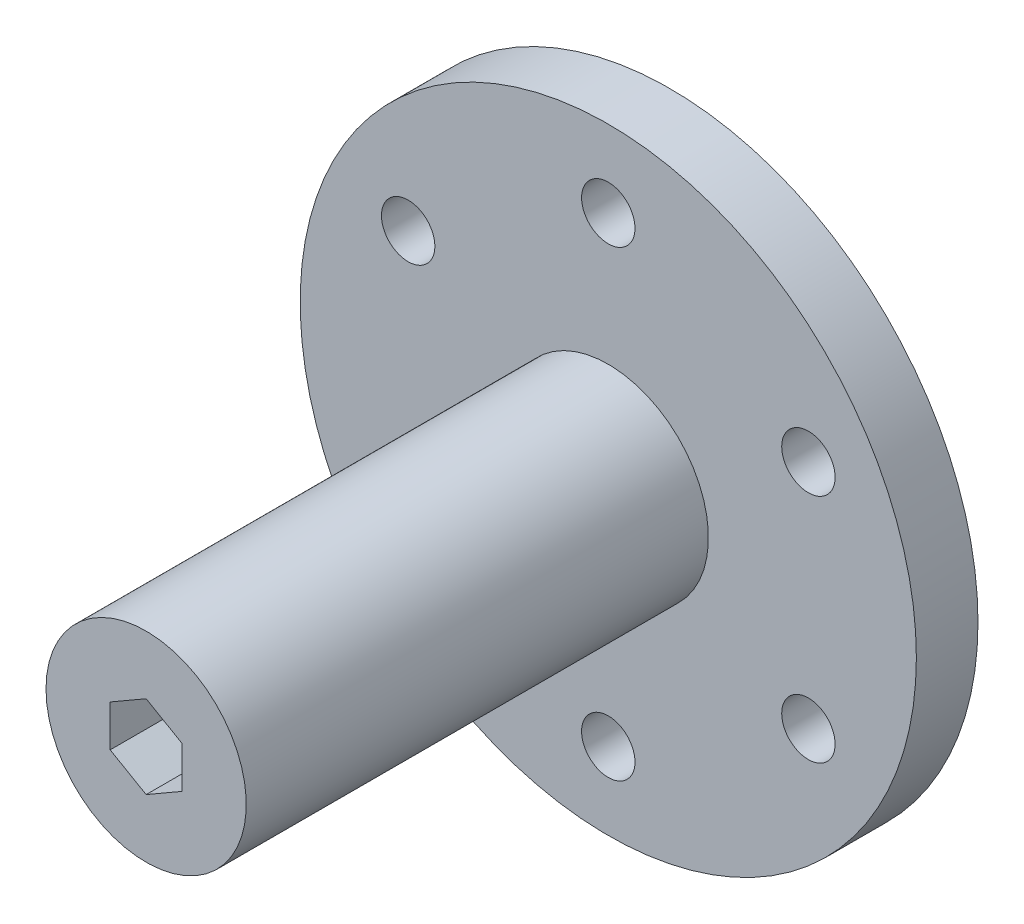
ISO-10303-21;
HEADER;
FILE_DESCRIPTION(('STEP AP214'),'2;1');
FILE_NAME('part.step','',(''),(''),'','','');
FILE_SCHEMA(('AUTOMOTIVE_DESIGN { 1 0 10303 214 1 1 1 1 }'));
ENDSEC;
DATA;
#1=APPLICATION_CONTEXT('core data for automotive mechanical design processes');
#2=APPLICATION_PROTOCOL_DEFINITION('international standard','automotive_design',2000,#1);
#3=PRODUCT_CONTEXT('',#1,'mechanical');
#4=PRODUCT('Part','Part','',(#3));
#5=PRODUCT_RELATED_PRODUCT_CATEGORY('part','',(#4));
#6=PRODUCT_DEFINITION_FORMATION('','',#4);
#7=PRODUCT_DEFINITION_CONTEXT('part definition',#1,'design');
#8=PRODUCT_DEFINITION('design','',#6,#7);
#9=PRODUCT_DEFINITION_SHAPE('','',#8);
#10=(LENGTH_UNIT() NAMED_UNIT(*) SI_UNIT(.MILLI.,.METRE.));
#11=(NAMED_UNIT(*) PLANE_ANGLE_UNIT() SI_UNIT($,.RADIAN.));
#12=(NAMED_UNIT(*) SI_UNIT($,.STERADIAN.) SOLID_ANGLE_UNIT());
#13=UNCERTAINTY_MEASURE_WITH_UNIT(LENGTH_MEASURE(1.E-05),#10,'distance_accuracy_value','');
#14=(GEOMETRIC_REPRESENTATION_CONTEXT(3) GLOBAL_UNCERTAINTY_ASSIGNED_CONTEXT((#13)) GLOBAL_UNIT_ASSIGNED_CONTEXT((#10,
#11,#12)) REPRESENTATION_CONTEXT('',''));
#15=CARTESIAN_POINT('',(0.,0.,0.));
#16=DIRECTION('',(0.,0.,1.));
#17=DIRECTION('',(1.,0.,0.));
#18=AXIS2_PLACEMENT_3D('',#15,#16,#17);
#19=CARTESIAN_POINT('',(0.,0.,6.));
#20=DIRECTION('',(0.,0.,-1.));
#21=DIRECTION('',(-1.,0.,0.));
#22=AXIS2_PLACEMENT_3D('',#19,#20,#21);
#23=CYLINDRICAL_SURFACE('',#22,30.);
#24=CARTESIAN_POINT('',(0.,0.,6.));
#25=DIRECTION('',(0.,0.,1.));
#26=DIRECTION('',(1.,0.,0.));
#27=AXIS2_PLACEMENT_3D('',#24,#25,#26);
#28=CIRCLE('',#27,30.);
#29=CARTESIAN_POINT('',(30.,0.,6.));
#30=VERTEX_POINT('',#29);
#31=EDGE_CURVE('E54',#30,#30,#28,.T.);
#32=ORIENTED_EDGE('',*,*,#31,.F.);
#33=EDGE_LOOP('',(#32));
#34=FACE_BOUND('',#33,.T.);
#35=CARTESIAN_POINT('',(0.,0.,0.));
#36=DIRECTION('',(0.,0.,1.));
#37=DIRECTION('',(1.,0.,0.));
#38=AXIS2_PLACEMENT_3D('',#35,#36,#37);
#39=CIRCLE('',#38,30.);
#40=CARTESIAN_POINT('',(30.,0.,0.));
#41=VERTEX_POINT('',#40);
#42=EDGE_CURVE('E48',#41,#41,#39,.T.);
#43=ORIENTED_EDGE('',*,*,#42,.T.);
#44=EDGE_LOOP('',(#43));
#45=FACE_BOUND('',#44,.T.);
#46=ADVANCED_FACE('F45',(#34,#45),#23,.T.);
#47=CARTESIAN_POINT('',(0.,0.,6.));
#48=DIRECTION('',(0.,0.,1.));
#49=DIRECTION('',(1.,0.,0.));
#50=AXIS2_PLACEMENT_3D('',#47,#48,#49);
#51=PLANE('',#50);
#52=CARTESIAN_POINT('',(0.,22.5,6.));
#53=DIRECTION('',(0.,0.,1.));
#54=DIRECTION('',(1.,0.,0.));
#55=AXIS2_PLACEMENT_3D('',#52,#53,#54);
#56=CIRCLE('',#55,2.6);
#57=CARTESIAN_POINT('',(2.6,22.5,6.));
#58=VERTEX_POINT('',#57);
#59=EDGE_CURVE('E129',#58,#58,#56,.T.);
#60=ORIENTED_EDGE('',*,*,#59,.F.);
#61=EDGE_LOOP('',(#60));
#62=FACE_BOUND('',#61,.T.);
#63=CARTESIAN_POINT('',(19.4855715851497,11.2500000000002,6.));
#64=DIRECTION('',(0.,0.,1.));
#65=DIRECTION('',(1.,0.,0.));
#66=AXIS2_PLACEMENT_3D('',#63,#64,#65);
#67=CIRCLE('',#66,2.6);
#68=CARTESIAN_POINT('',(22.0855715851497,11.2500000000002,6.));
#69=VERTEX_POINT('',#68);
#70=EDGE_CURVE('E389',#69,#69,#67,.T.);
#71=ORIENTED_EDGE('',*,*,#70,.F.);
#72=EDGE_LOOP('',(#71));
#73=FACE_BOUND('',#72,.T.);
#74=CARTESIAN_POINT('',(19.48557158515,-11.2499999999998,6.));
#75=DIRECTION('',(0.,0.,1.));
#76=DIRECTION('',(1.,0.,0.));
#77=AXIS2_PLACEMENT_3D('',#74,#75,#76);
#78=CIRCLE('',#77,2.6);
#79=CARTESIAN_POINT('',(22.08557158515,-11.2499999999998,6.));
#80=VERTEX_POINT('',#79);
#81=EDGE_CURVE('E386',#80,#80,#78,.T.);
#82=ORIENTED_EDGE('',*,*,#81,.F.);
#83=EDGE_LOOP('',(#82));
#84=FACE_BOUND('',#83,.T.);
#85=CARTESIAN_POINT('',(1.57116660247941E-13,-22.5,6.));
#86=DIRECTION('',(0.,0.,1.));
#87=DIRECTION('',(1.,0.,0.));
#88=AXIS2_PLACEMENT_3D('',#85,#86,#87);
#89=CIRCLE('',#88,2.6);
#90=CARTESIAN_POINT('',(2.60000000000016,-22.5,6.));
#91=VERTEX_POINT('',#90);
#92=EDGE_CURVE('E382',#91,#91,#89,.T.);
#93=ORIENTED_EDGE('',*,*,#92,.F.);
#94=EDGE_LOOP('',(#93));
#95=FACE_BOUND('',#94,.T.);
#96=CARTESIAN_POINT('',(-19.4855715851498,-11.2500000000001,6.));
#97=DIRECTION('',(0.,0.,1.));
#98=DIRECTION('',(1.,0.,0.));
#99=AXIS2_PLACEMENT_3D('',#96,#97,#98);
#100=CIRCLE('',#99,2.6);
#101=CARTESIAN_POINT('',(-16.8855715851498,-11.2500000000001,6.));
#102=VERTEX_POINT('',#101);
#103=EDGE_CURVE('E358',#102,#102,#100,.T.);
#104=ORIENTED_EDGE('',*,*,#103,.F.);
#105=EDGE_LOOP('',(#104));
#106=FACE_BOUND('',#105,.T.);
#107=CARTESIAN_POINT('',(-19.4855715851499,11.25,6.));
#108=DIRECTION('',(0.,0.,1.));
#109=DIRECTION('',(1.,0.,0.));
#110=AXIS2_PLACEMENT_3D('',#107,#108,#109);
#111=CIRCLE('',#110,2.6);
#112=CARTESIAN_POINT('',(-16.8855715851499,11.25,6.));
#113=VERTEX_POINT('',#112);
#114=EDGE_CURVE('E352',#113,#113,#111,.T.);
#115=ORIENTED_EDGE('',*,*,#114,.F.);
#116=EDGE_LOOP('',(#115));
#117=FACE_BOUND('',#116,.T.);
#118=CARTESIAN_POINT('',(0.,0.,6.));
#119=DIRECTION('',(0.,0.,1.));
#120=DIRECTION('',(1.,0.,0.));
#121=AXIS2_PLACEMENT_3D('',#118,#119,#120);
#122=CIRCLE('',#121,9.75);
#123=CARTESIAN_POINT('',(-9.75,0.,6.00000000000001));
#124=VERTEX_POINT('',#123);
#125=EDGE_CURVE('E11',#124,#124,#122,.T.);
#126=ORIENTED_EDGE('',*,*,#125,.F.);
#127=EDGE_LOOP('',(#126));
#128=FACE_BOUND('',#127,.T.);
#129=ORIENTED_EDGE('',*,*,#31,.T.);
#130=EDGE_LOOP('',(#129));
#131=FACE_BOUND('',#130,.T.);
#132=ADVANCED_FACE('F186',(#62,#73,#84,#95,#106,#117,#128,#131),#51,.T.);
#133=CARTESIAN_POINT('',(0.,0.,0.));
#134=DIRECTION('',(0.,0.,1.));
#135=DIRECTION('',(1.,0.,0.));
#136=AXIS2_PLACEMENT_3D('',#133,#134,#135);
#137=PLANE('',#136);
#138=CARTESIAN_POINT('',(0.,22.5,0.));
#139=DIRECTION('',(0.,0.,-1.));
#140=DIRECTION('',(-1.,0.,0.));
#141=AXIS2_PLACEMENT_3D('',#138,#139,#140);
#142=CIRCLE('',#141,2.6);
#143=CARTESIAN_POINT('',(-2.6,22.5,0.));
#144=VERTEX_POINT('',#143);
#145=EDGE_CURVE('E350',#144,#144,#142,.T.);
#146=ORIENTED_EDGE('',*,*,#145,.F.);
#147=EDGE_LOOP('',(#146));
#148=FACE_BOUND('',#147,.T.);
#149=CARTESIAN_POINT('',(19.4855715851497,11.2500000000002,0.));
#150=DIRECTION('',(0.,0.,-1.));
#151=DIRECTION('',(-1.,0.,0.));
#152=AXIS2_PLACEMENT_3D('',#149,#150,#151);
#153=CIRCLE('',#152,2.6);
#154=CARTESIAN_POINT('',(16.8855715851497,11.2500000000002,0.));
#155=VERTEX_POINT('',#154);
#156=EDGE_CURVE('E364',#155,#155,#153,.T.);
#157=ORIENTED_EDGE('',*,*,#156,.F.);
#158=EDGE_LOOP('',(#157));
#159=FACE_BOUND('',#158,.T.);
#160=CARTESIAN_POINT('',(19.48557158515,-11.2499999999998,0.));
#161=DIRECTION('',(0.,0.,-1.));
#162=DIRECTION('',(-1.,0.,0.));
#163=AXIS2_PLACEMENT_3D('',#160,#161,#162);
#164=CIRCLE('',#163,2.6);
#165=CARTESIAN_POINT('',(16.88557158515,-11.2499999999998,0.));
#166=VERTEX_POINT('',#165);
#167=EDGE_CURVE('E367',#166,#166,#164,.T.);
#168=ORIENTED_EDGE('',*,*,#167,.F.);
#169=EDGE_LOOP('',(#168));
#170=FACE_BOUND('',#169,.T.);
#171=CARTESIAN_POINT('',(1.57116660247941E-13,-22.5,0.));
#172=DIRECTION('',(0.,0.,-1.));
#173=DIRECTION('',(-1.,0.,0.));
#174=AXIS2_PLACEMENT_3D('',#171,#172,#173);
#175=CIRCLE('',#174,2.6);
#176=CARTESIAN_POINT('',(-2.59999999999984,-22.5,0.));
#177=VERTEX_POINT('',#176);
#178=EDGE_CURVE('E372',#177,#177,#175,.T.);
#179=ORIENTED_EDGE('',*,*,#178,.F.);
#180=EDGE_LOOP('',(#179));
#181=FACE_BOUND('',#180,.T.);
#182=CARTESIAN_POINT('',(-19.4855715851498,-11.2500000000001,0.));
#183=DIRECTION('',(0.,0.,-1.));
#184=DIRECTION('',(-1.,0.,0.));
#185=AXIS2_PLACEMENT_3D('',#182,#183,#184);
#186=CIRCLE('',#185,2.6);
#187=CARTESIAN_POINT('',(-22.0855715851498,-11.2500000000001,0.));
#188=VERTEX_POINT('',#187);
#189=EDGE_CURVE('E361',#188,#188,#186,.T.);
#190=ORIENTED_EDGE('',*,*,#189,.F.);
#191=EDGE_LOOP('',(#190));
#192=FACE_BOUND('',#191,.T.);
#193=CARTESIAN_POINT('',(-19.4855715851499,11.25,0.));
#194=DIRECTION('',(0.,0.,-1.));
#195=DIRECTION('',(-1.,0.,0.));
#196=AXIS2_PLACEMENT_3D('',#193,#194,#195);
#197=CIRCLE('',#196,2.6);
#198=CARTESIAN_POINT('',(-22.0855715851499,11.25,0.));
#199=VERTEX_POINT('',#198);
#200=EDGE_CURVE('E353',#199,#199,#197,.T.);
#201=ORIENTED_EDGE('',*,*,#200,.F.);
#202=EDGE_LOOP('',(#201));
#203=FACE_BOUND('',#202,.T.);
#204=DIRECTION('',(0.,1.,0.));
#205=VECTOR('',#204,1.);
#206=CARTESIAN_POINT('',(3.5,-2.02072594216369,0.));
#207=LINE('',#206,#205);
#208=CARTESIAN_POINT('',(3.5,-2.02072594216369,0.));
#209=VERTEX_POINT('',#208);
#210=CARTESIAN_POINT('',(3.5,2.02072594216369,0.));
#211=VERTEX_POINT('',#210);
#212=EDGE_CURVE('E109',#209,#211,#207,.T.);
#213=ORIENTED_EDGE('',*,*,#212,.T.);
#214=DIRECTION('',(-0.866025403784439,0.5,0.));
#215=VECTOR('',#214,1.);
#216=CARTESIAN_POINT('',(3.5,2.02072594216369,0.));
#217=LINE('',#216,#215);
#218=CARTESIAN_POINT('',(0.,4.04145188432738,0.));
#219=VERTEX_POINT('',#218);
#220=EDGE_CURVE('E102',#211,#219,#217,.T.);
#221=ORIENTED_EDGE('',*,*,#220,.T.);
#222=DIRECTION('',(-0.866025403784439,-0.5,0.));
#223=VECTOR('',#222,1.);
#224=CARTESIAN_POINT('',(0.,4.04145188432738,0.));
#225=LINE('',#224,#223);
#226=CARTESIAN_POINT('',(-3.5,2.02072594216369,0.));
#227=VERTEX_POINT('',#226);
#228=EDGE_CURVE('E112',#219,#227,#225,.T.);
#229=ORIENTED_EDGE('',*,*,#228,.T.);
#230=DIRECTION('',(0.,-1.,0.));
#231=VECTOR('',#230,1.);
#232=CARTESIAN_POINT('',(-3.5,2.02072594216369,0.));
#233=LINE('',#232,#231);
#234=CARTESIAN_POINT('',(-3.5,-2.02072594216369,0.));
#235=VERTEX_POINT('',#234);
#236=EDGE_CURVE('E62',#227,#235,#233,.T.);
#237=ORIENTED_EDGE('',*,*,#236,.T.);
#238=DIRECTION('',(0.866025403784439,-0.5,0.));
#239=VECTOR('',#238,1.);
#240=CARTESIAN_POINT('',(-3.5,-2.02072594216369,0.));
#241=LINE('',#240,#239);
#242=CARTESIAN_POINT('',(0.,-4.04145188432738,0.));
#243=VERTEX_POINT('',#242);
#244=EDGE_CURVE('E134',#235,#243,#241,.T.);
#245=ORIENTED_EDGE('',*,*,#244,.T.);
#246=DIRECTION('',(0.866025403784439,0.5,0.));
#247=VECTOR('',#246,1.);
#248=CARTESIAN_POINT('',(0.,-4.04145188432738,0.));
#249=LINE('',#248,#247);
#250=EDGE_CURVE('E138',#243,#209,#249,.T.);
#251=ORIENTED_EDGE('',*,*,#250,.T.);
#252=EDGE_LOOP('',(#213,#221,#229,#237,#245,#251));
#253=FACE_BOUND('',#252,.T.);
#254=ORIENTED_EDGE('',*,*,#42,.F.);
#255=EDGE_LOOP('',(#254));
#256=FACE_BOUND('',#255,.T.);
#257=ADVANCED_FACE('F117',(#148,#159,#170,#181,#192,#203,#253,#256),#137,.F.);
#258=CARTESIAN_POINT('',(0.,0.,51.));
#259=DIRECTION('',(0.,0.,-1.));
#260=DIRECTION('',(-1.,0.,0.));
#261=AXIS2_PLACEMENT_3D('',#258,#259,#260);
#262=CYLINDRICAL_SURFACE('',#261,9.75);
#263=CARTESIAN_POINT('',(0.,0.,51.));
#264=DIRECTION('',(0.,0.,1.));
#265=DIRECTION('',(1.,0.,0.));
#266=AXIS2_PLACEMENT_3D('',#263,#264,#265);
#267=CIRCLE('',#266,9.75);
#268=CARTESIAN_POINT('',(-9.75,0.,51.));
#269=VERTEX_POINT('',#268);
#270=EDGE_CURVE('E162',#269,#269,#267,.T.);
#271=CARTESIAN_POINT('',(-9.75,0.,51.));
#272=CARTESIAN_POINT('',(-9.75,0.,50.53125));
#273=CARTESIAN_POINT('',(-9.75,0.,50.0625));
#274=CARTESIAN_POINT('',(-9.75,0.,49.125));
#275=CARTESIAN_POINT('',(-9.75,0.,48.65625));
#276=CARTESIAN_POINT('',(-9.75,0.,47.71875));
#277=CARTESIAN_POINT('',(-9.75,0.,47.25));
#278=CARTESIAN_POINT('',(-9.75,0.,46.3125));
#279=CARTESIAN_POINT('',(-9.75,0.,45.84375));
#280=CARTESIAN_POINT('',(-9.75,0.,44.90625));
#281=CARTESIAN_POINT('',(-9.75,0.,44.4375));
#282=CARTESIAN_POINT('',(-9.75,0.,43.5));
#283=CARTESIAN_POINT('',(-9.75,0.,43.03125));
#284=CARTESIAN_POINT('',(-9.75,0.,42.09375));
#285=CARTESIAN_POINT('',(-9.75,0.,41.625));
#286=CARTESIAN_POINT('',(-9.75,0.,40.6875));
#287=CARTESIAN_POINT('',(-9.75,0.,40.21875));
#288=CARTESIAN_POINT('',(-9.75,0.,39.28125));
#289=CARTESIAN_POINT('',(-9.75,0.,38.8125));
#290=CARTESIAN_POINT('',(-9.75,0.,37.875));
#291=CARTESIAN_POINT('',(-9.75,0.,37.40625));
#292=CARTESIAN_POINT('',(-9.75,0.,36.46875));
#293=CARTESIAN_POINT('',(-9.75,0.,36.));
#294=CARTESIAN_POINT('',(-9.75,0.,35.0625));
#295=CARTESIAN_POINT('',(-9.75,0.,34.59375));
#296=CARTESIAN_POINT('',(-9.75,0.,33.65625));
#297=CARTESIAN_POINT('',(-9.75,0.,33.1875));
#298=CARTESIAN_POINT('',(-9.75,0.,32.25));
#299=CARTESIAN_POINT('',(-9.75,0.,31.78125));
#300=CARTESIAN_POINT('',(-9.75,0.,30.84375));
#301=CARTESIAN_POINT('',(-9.75,0.,30.375));
#302=CARTESIAN_POINT('',(-9.75,0.,29.4375));
#303=CARTESIAN_POINT('',(-9.75,0.,28.96875));
#304=CARTESIAN_POINT('',(-9.75,0.,28.03125));
#305=CARTESIAN_POINT('',(-9.75,0.,27.5625));
#306=CARTESIAN_POINT('',(-9.75,0.,26.625));
#307=CARTESIAN_POINT('',(-9.75,0.,26.15625));
#308=CARTESIAN_POINT('',(-9.75,0.,25.21875));
#309=CARTESIAN_POINT('',(-9.75,0.,24.75));
#310=CARTESIAN_POINT('',(-9.75,0.,23.8125));
#311=CARTESIAN_POINT('',(-9.75,0.,23.34375));
#312=CARTESIAN_POINT('',(-9.75,0.,22.40625));
#313=CARTESIAN_POINT('',(-9.75,0.,21.9375));
#314=CARTESIAN_POINT('',(-9.75,0.,21.));
#315=CARTESIAN_POINT('',(-9.75,0.,20.53125));
#316=CARTESIAN_POINT('',(-9.75,0.,19.59375));
#317=CARTESIAN_POINT('',(-9.75,0.,19.125));
#318=CARTESIAN_POINT('',(-9.75,0.,18.1875));
#319=CARTESIAN_POINT('',(-9.75,0.,17.71875));
#320=CARTESIAN_POINT('',(-9.75,0.,16.78125));
#321=CARTESIAN_POINT('',(-9.75,0.,16.3125));
#322=CARTESIAN_POINT('',(-9.75,0.,15.375));
#323=CARTESIAN_POINT('',(-9.75,0.,14.90625));
#324=CARTESIAN_POINT('',(-9.75,0.,13.96875));
#325=CARTESIAN_POINT('',(-9.75,0.,13.5));
#326=CARTESIAN_POINT('',(-9.75,0.,12.5625));
#327=CARTESIAN_POINT('',(-9.75,0.,12.09375));
#328=CARTESIAN_POINT('',(-9.75,0.,11.15625));
#329=CARTESIAN_POINT('',(-9.75,0.,10.6875));
#330=CARTESIAN_POINT('',(-9.75,0.,9.75000000000001));
#331=CARTESIAN_POINT('',(-9.75,0.,9.28125000000001));
#332=CARTESIAN_POINT('',(-9.75,0.,8.34375000000001));
#333=CARTESIAN_POINT('',(-9.75,0.,7.87500000000001));
#334=CARTESIAN_POINT('',(-9.75,0.,6.9375));
#335=CARTESIAN_POINT('',(-9.75,0.,6.46875));
#336=CARTESIAN_POINT('',(-9.75,0.,6.00000000000001));
#337=B_SPLINE_CURVE_WITH_KNOTS('',3,(#271,#272,#273,#274,#275,#276,#277,#278,#279,#280,#281,
#282,#283,#284,#285,#286,#287,#288,#289,#290,#291,#292,#293,#294,#295,#296,#297,#298,#299,#300,
#301,#302,#303,#304,#305,#306,#307,#308,#309,#310,#311,#312,#313,#314,#315,#316,#317,#318,#319,
#320,#321,#322,#323,#324,#325,#326,#327,#328,#329,#330,#331,#332,#333,#334,#335,#336),
.UNSPECIFIED.,.F.,.F.,(4,2,2,2,2,2,2,2,2,2,2,2,2,2,2,2,2,2,2,2,2,2,2,2,2,2,2,2,2,2,2,2,4),(0.,
1.40625,2.8125,4.21875,5.62500000000001,7.03125,8.4375,9.84375000000001,11.25,12.65625,14.0625,
15.46875,16.875,18.28125,19.6875,21.09375,22.5,23.90625,25.3125,26.71875,28.125,29.53125,
30.9375,32.34375,33.75,35.15625,36.5625,37.96875,39.375,40.78125,42.1875,43.59375,45.),.UNSPECIFIED.);
#338=EDGE_CURVE('BSEAM185',#269,#124,#337,.T.);
#339=ORIENTED_EDGE('',*,*,#270,.F.);
#340=ORIENTED_EDGE('',*,*,#125,.T.);
#341=ORIENTED_EDGE('',*,*,#338,.T.);
#342=ORIENTED_EDGE('',*,*,#338,.F.);
#343=EDGE_LOOP('',(#339,#341,#340,#342));
#344=FACE_BOUND('',#343,.T.);
#345=ADVANCED_FACE('F185',(#344),#262,.T.);
#346=CARTESIAN_POINT('',(0.,0.,51.));
#347=DIRECTION('',(0.,0.,1.));
#348=DIRECTION('',(1.,0.,0.));
#349=AXIS2_PLACEMENT_3D('',#346,#347,#348);
#350=PLANE('',#349);
#351=DIRECTION('',(-0.866025403784439,0.5,0.));
#352=VECTOR('',#351,1.);
#353=CARTESIAN_POINT('',(3.5,2.02072594216369,51.));
#354=LINE('',#353,#352);
#355=CARTESIAN_POINT('',(3.5,2.02072594216369,51.));
#356=VERTEX_POINT('',#355);
#357=CARTESIAN_POINT('',(0.,4.04145188432738,51.));
#358=VERTEX_POINT('',#357);
#359=EDGE_CURVE('E70',#356,#358,#354,.T.);
#360=ORIENTED_EDGE('',*,*,#359,.F.);
#361=DIRECTION('',(0.,1.,0.));
#362=VECTOR('',#361,1.);
#363=CARTESIAN_POINT('',(3.5,-2.02072594216369,51.));
#364=LINE('',#363,#362);
#365=CARTESIAN_POINT('',(3.5,-2.02072594216369,51.));
#366=VERTEX_POINT('',#365);
#367=EDGE_CURVE('E122',#366,#356,#364,.T.);
#368=ORIENTED_EDGE('',*,*,#367,.F.);
#369=DIRECTION('',(0.866025403784439,0.5,0.));
#370=VECTOR('',#369,1.);
#371=CARTESIAN_POINT('',(0.,-4.04145188432738,51.));
#372=LINE('',#371,#370);
#373=CARTESIAN_POINT('',(0.,-4.04145188432738,51.));
#374=VERTEX_POINT('',#373);
#375=EDGE_CURVE('E126',#374,#366,#372,.T.);
#376=ORIENTED_EDGE('',*,*,#375,.F.);
#377=DIRECTION('',(0.866025403784439,-0.5,0.));
#378=VECTOR('',#377,1.);
#379=CARTESIAN_POINT('',(-3.5,-2.02072594216369,51.));
#380=LINE('',#379,#378);
#381=CARTESIAN_POINT('',(-3.5,-2.02072594216369,51.));
#382=VERTEX_POINT('',#381);
#383=EDGE_CURVE('E152',#382,#374,#380,.T.);
#384=ORIENTED_EDGE('',*,*,#383,.F.);
#385=DIRECTION('',(0.,-1.,0.));
#386=VECTOR('',#385,1.);
#387=CARTESIAN_POINT('',(-3.5,2.02072594216369,51.));
#388=LINE('',#387,#386);
#389=CARTESIAN_POINT('',(-3.5,2.02072594216369,51.));
#390=VERTEX_POINT('',#389);
#391=EDGE_CURVE('E148',#390,#382,#388,.T.);
#392=ORIENTED_EDGE('',*,*,#391,.F.);
#393=DIRECTION('',(-0.866025403784439,-0.5,0.));
#394=VECTOR('',#393,1.);
#395=CARTESIAN_POINT('',(0.,4.04145188432738,51.));
#396=LINE('',#395,#394);
#397=EDGE_CURVE('E145',#358,#390,#396,.T.);
#398=ORIENTED_EDGE('',*,*,#397,.F.);
#399=EDGE_LOOP('',(#360,#368,#376,#384,#392,#398));
#400=FACE_BOUND('',#399,.T.);
#401=ORIENTED_EDGE('',*,*,#270,.T.);
#402=EDGE_LOOP('',(#401));
#403=FACE_BOUND('',#402,.T.);
#404=ADVANCED_FACE('F193',(#400,#403),#350,.T.);
#405=CARTESIAN_POINT('',(3.5,2.02072594216369,0.));
#406=DIRECTION('',(0.5,0.866025403784439,0.));
#407=DIRECTION('',(-0.866025403784439,0.5,0.));
#408=AXIS2_PLACEMENT_3D('',#405,#406,#407);
#409=PLANE('',#408);
#410=ORIENTED_EDGE('',*,*,#359,.T.);
#411=DIRECTION('',(0.,0.,1.));
#412=VECTOR('',#411,1.);
#413=CARTESIAN_POINT('',(0.,4.04145188432738,0.));
#414=LINE('',#413,#412);
#415=EDGE_CURVE('E98',#219,#358,#414,.T.);
#416=ORIENTED_EDGE('',*,*,#415,.F.);
#417=ORIENTED_EDGE('',*,*,#220,.F.);
#418=DIRECTION('',(0.,0.,1.));
#419=VECTOR('',#418,1.);
#420=CARTESIAN_POINT('',(3.5,2.02072594216369,0.));
#421=LINE('',#420,#419);
#422=EDGE_CURVE('E159',#211,#356,#421,.T.);
#423=ORIENTED_EDGE('',*,*,#422,.T.);
#424=EDGE_LOOP('',(#410,#416,#417,#423));
#425=FACE_BOUND('',#424,.T.);
#426=ADVANCED_FACE('F100',(#425),#409,.F.);
#427=CARTESIAN_POINT('',(3.5,-2.02072594216369,0.));
#428=DIRECTION('',(1.,0.,0.));
#429=DIRECTION('',(0.,1.,0.));
#430=AXIS2_PLACEMENT_3D('',#427,#428,#429);
#431=PLANE('',#430);
#432=ORIENTED_EDGE('',*,*,#367,.T.);
#433=ORIENTED_EDGE('',*,*,#422,.F.);
#434=ORIENTED_EDGE('',*,*,#212,.F.);
#435=DIRECTION('',(0.,0.,1.));
#436=VECTOR('',#435,1.);
#437=CARTESIAN_POINT('',(3.5,-2.02072594216369,0.));
#438=LINE('',#437,#436);
#439=EDGE_CURVE('E163',#209,#366,#438,.T.);
#440=ORIENTED_EDGE('',*,*,#439,.T.);
#441=EDGE_LOOP('',(#432,#433,#434,#440));
#442=FACE_BOUND('',#441,.T.);
#443=ADVANCED_FACE('F225',(#442),#431,.F.);
#444=CARTESIAN_POINT('',(0.,-4.04145188432738,0.));
#445=DIRECTION('',(0.5,-0.866025403784439,0.));
#446=DIRECTION('',(0.866025403784439,0.5,0.));
#447=AXIS2_PLACEMENT_3D('',#444,#445,#446);
#448=PLANE('',#447);
#449=ORIENTED_EDGE('',*,*,#375,.T.);
#450=ORIENTED_EDGE('',*,*,#439,.F.);
#451=ORIENTED_EDGE('',*,*,#250,.F.);
#452=DIRECTION('',(0.,0.,1.));
#453=VECTOR('',#452,1.);
#454=CARTESIAN_POINT('',(0.,-4.04145188432738,0.));
#455=LINE('',#454,#453);
#456=EDGE_CURVE('E166',#243,#374,#455,.T.);
#457=ORIENTED_EDGE('',*,*,#456,.T.);
#458=EDGE_LOOP('',(#449,#450,#451,#457));
#459=FACE_BOUND('',#458,.T.);
#460=ADVANCED_FACE('F233',(#459),#448,.F.);
#461=CARTESIAN_POINT('',(-3.5,-2.02072594216369,0.));
#462=DIRECTION('',(-0.5,-0.866025403784439,0.));
#463=DIRECTION('',(0.866025403784439,-0.5,0.));
#464=AXIS2_PLACEMENT_3D('',#461,#462,#463);
#465=PLANE('',#464);
#466=ORIENTED_EDGE('',*,*,#383,.T.);
#467=ORIENTED_EDGE('',*,*,#456,.F.);
#468=ORIENTED_EDGE('',*,*,#244,.F.);
#469=DIRECTION('',(0.,0.,1.));
#470=VECTOR('',#469,1.);
#471=CARTESIAN_POINT('',(-3.5,-2.02072594216369,0.));
#472=LINE('',#471,#470);
#473=EDGE_CURVE('E169',#235,#382,#472,.T.);
#474=ORIENTED_EDGE('',*,*,#473,.T.);
#475=EDGE_LOOP('',(#466,#467,#468,#474));
#476=FACE_BOUND('',#475,.T.);
#477=ADVANCED_FACE('F242',(#476),#465,.F.);
#478=CARTESIAN_POINT('',(-3.5,2.02072594216369,0.));
#479=DIRECTION('',(-1.,0.,0.));
#480=DIRECTION('',(0.,0.,1.));
#481=AXIS2_PLACEMENT_3D('',#478,#479,#480);
#482=PLANE('',#481);
#483=ORIENTED_EDGE('',*,*,#391,.T.);
#484=ORIENTED_EDGE('',*,*,#473,.F.);
#485=ORIENTED_EDGE('',*,*,#236,.F.);
#486=DIRECTION('',(0.,0.,1.));
#487=VECTOR('',#486,1.);
#488=CARTESIAN_POINT('',(-3.5,2.02072594216369,0.));
#489=LINE('',#488,#487);
#490=EDGE_CURVE('E108',#227,#390,#489,.T.);
#491=ORIENTED_EDGE('',*,*,#490,.T.);
#492=EDGE_LOOP('',(#483,#484,#485,#491));
#493=FACE_BOUND('',#492,.T.);
#494=ADVANCED_FACE('F251',(#493),#482,.F.);
#495=CARTESIAN_POINT('',(0.,4.04145188432738,0.));
#496=DIRECTION('',(-0.5,0.866025403784439,0.));
#497=DIRECTION('',(-0.866025403784439,-0.5,0.));
#498=AXIS2_PLACEMENT_3D('',#495,#496,#497);
#499=PLANE('',#498);
#500=ORIENTED_EDGE('',*,*,#397,.T.);
#501=ORIENTED_EDGE('',*,*,#490,.F.);
#502=ORIENTED_EDGE('',*,*,#228,.F.);
#503=ORIENTED_EDGE('',*,*,#415,.T.);
#504=EDGE_LOOP('',(#500,#501,#502,#503));
#505=FACE_BOUND('',#504,.T.);
#506=ADVANCED_FACE('F113',(#505),#499,.F.);
#507=CARTESIAN_POINT('',(-19.4855715851499,11.25,30.));
#508=DIRECTION('',(0.,0.,-1.));
#509=DIRECTION('',(-1.,0.,0.));
#510=AXIS2_PLACEMENT_3D('',#507,#508,#509);
#511=CYLINDRICAL_SURFACE('',#510,2.6);
#512=ORIENTED_EDGE('',*,*,#114,.T.);
#513=EDGE_LOOP('',(#512));
#514=FACE_BOUND('',#513,.T.);
#515=ORIENTED_EDGE('',*,*,#200,.T.);
#516=EDGE_LOOP('',(#515));
#517=FACE_BOUND('',#516,.T.);
#518=ADVANCED_FACE('F266',(#514,#517),#511,.F.);
#519=CARTESIAN_POINT('',(-19.4855715851498,-11.2500000000001,30.));
#520=DIRECTION('',(0.,0.,-1.));
#521=DIRECTION('',(-1.,0.,0.));
#522=AXIS2_PLACEMENT_3D('',#519,#520,#521);
#523=CYLINDRICAL_SURFACE('',#522,2.6);
#524=ORIENTED_EDGE('',*,*,#103,.T.);
#525=EDGE_LOOP('',(#524));
#526=FACE_BOUND('',#525,.T.);
#527=ORIENTED_EDGE('',*,*,#189,.T.);
#528=EDGE_LOOP('',(#527));
#529=FACE_BOUND('',#528,.T.);
#530=ADVANCED_FACE('F292',(#526,#529),#523,.F.);
#531=CARTESIAN_POINT('',(1.57116660247941E-13,-22.5,30.));
#532=DIRECTION('',(0.,0.,-1.));
#533=DIRECTION('',(-1.,0.,0.));
#534=AXIS2_PLACEMENT_3D('',#531,#532,#533);
#535=CYLINDRICAL_SURFACE('',#534,2.6);
#536=ORIENTED_EDGE('',*,*,#92,.T.);
#537=EDGE_LOOP('',(#536));
#538=FACE_BOUND('',#537,.T.);
#539=ORIENTED_EDGE('',*,*,#178,.T.);
#540=EDGE_LOOP('',(#539));
#541=FACE_BOUND('',#540,.T.);
#542=ADVANCED_FACE('F301',(#538,#541),#535,.F.);
#543=CARTESIAN_POINT('',(19.48557158515,-11.2499999999998,30.));
#544=DIRECTION('',(0.,0.,-1.));
#545=DIRECTION('',(-1.,0.,0.));
#546=AXIS2_PLACEMENT_3D('',#543,#544,#545);
#547=CYLINDRICAL_SURFACE('',#546,2.6);
#548=ORIENTED_EDGE('',*,*,#81,.T.);
#549=EDGE_LOOP('',(#548));
#550=FACE_BOUND('',#549,.T.);
#551=ORIENTED_EDGE('',*,*,#167,.T.);
#552=EDGE_LOOP('',(#551));
#553=FACE_BOUND('',#552,.T.);
#554=ADVANCED_FACE('F310',(#550,#553),#547,.F.);
#555=CARTESIAN_POINT('',(19.4855715851497,11.2500000000002,30.));
#556=DIRECTION('',(0.,0.,-1.));
#557=DIRECTION('',(-1.,0.,0.));
#558=AXIS2_PLACEMENT_3D('',#555,#556,#557);
#559=CYLINDRICAL_SURFACE('',#558,2.6);
#560=ORIENTED_EDGE('',*,*,#70,.T.);
#561=EDGE_LOOP('',(#560));
#562=FACE_BOUND('',#561,.T.);
#563=ORIENTED_EDGE('',*,*,#156,.T.);
#564=EDGE_LOOP('',(#563));
#565=FACE_BOUND('',#564,.T.);
#566=ADVANCED_FACE('F319',(#562,#565),#559,.F.);
#567=CARTESIAN_POINT('',(0.,22.5,30.));
#568=DIRECTION('',(0.,0.,-1.));
#569=DIRECTION('',(-1.,0.,0.));
#570=AXIS2_PLACEMENT_3D('',#567,#568,#569);
#571=CYLINDRICAL_SURFACE('',#570,2.6);
#572=ORIENTED_EDGE('',*,*,#59,.T.);
#573=EDGE_LOOP('',(#572));
#574=FACE_BOUND('',#573,.T.);
#575=ORIENTED_EDGE('',*,*,#145,.T.);
#576=EDGE_LOOP('',(#575));
#577=FACE_BOUND('',#576,.T.);
#578=ADVANCED_FACE('F328',(#574,#577),#571,.F.);
#579=CLOSED_SHELL('',(#46,#132,#257,#345,#404,#426,#443,#460,#477,#494,#506,#518,#530,#542,#554,
#566,#578));
#580=MANIFOLD_SOLID_BREP('B2',#579);
#581=ADVANCED_BREP_SHAPE_REPRESENTATION('',(#18,#580),#14);
#582=SHAPE_DEFINITION_REPRESENTATION(#9,#581);
ENDSEC;
END-ISO-10303-21;
